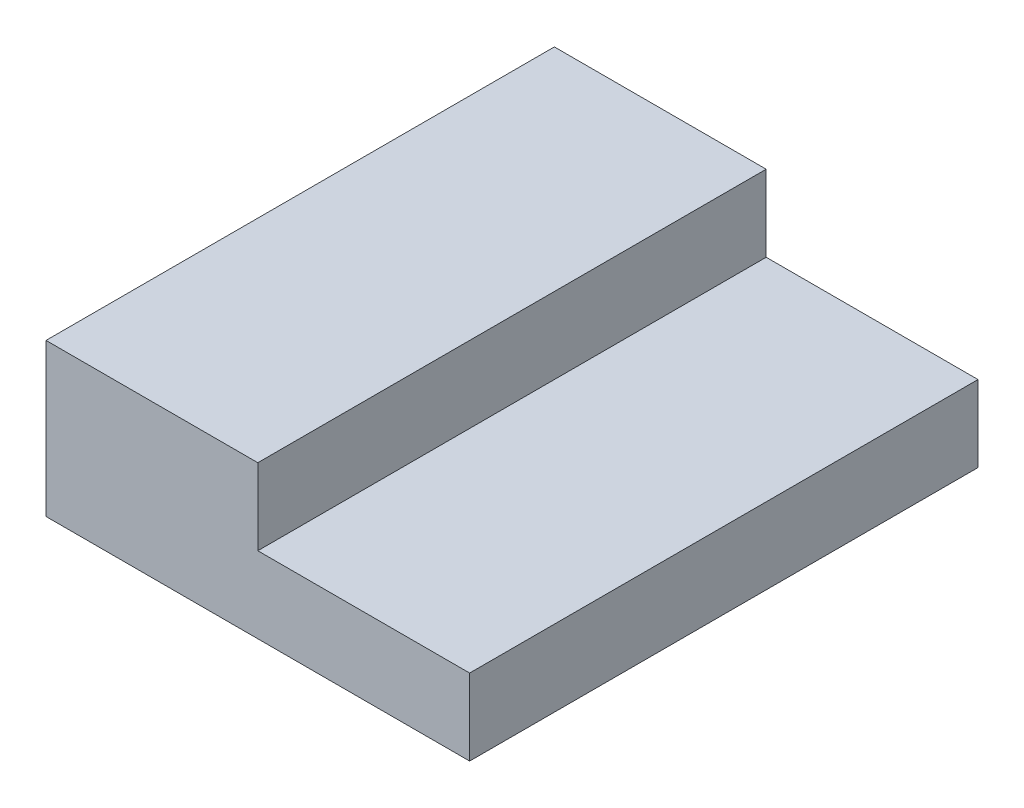
ISO-10303-21;
HEADER;
FILE_DESCRIPTION(('STEP AP214'),'2;1');
FILE_NAME('part.step','',(''),(''),'','','');
FILE_SCHEMA(('AUTOMOTIVE_DESIGN { 1 0 10303 214 1 1 1 1 }'));
ENDSEC;
DATA;
#1=APPLICATION_CONTEXT('core data for automotive mechanical design processes');
#2=APPLICATION_PROTOCOL_DEFINITION('international standard','automotive_design',2000,#1);
#3=PRODUCT_CONTEXT('',#1,'mechanical');
#4=PRODUCT('Part','Part','',(#3));
#5=PRODUCT_RELATED_PRODUCT_CATEGORY('part','',(#4));
#6=PRODUCT_DEFINITION_FORMATION('','',#4);
#7=PRODUCT_DEFINITION_CONTEXT('part definition',#1,'design');
#8=PRODUCT_DEFINITION('design','',#6,#7);
#9=PRODUCT_DEFINITION_SHAPE('','',#8);
#10=(LENGTH_UNIT() NAMED_UNIT(*) SI_UNIT(.MILLI.,.METRE.));
#11=(NAMED_UNIT(*) PLANE_ANGLE_UNIT() SI_UNIT($,.RADIAN.));
#12=(NAMED_UNIT(*) SI_UNIT($,.STERADIAN.) SOLID_ANGLE_UNIT());
#13=UNCERTAINTY_MEASURE_WITH_UNIT(LENGTH_MEASURE(1.E-05),#10,'distance_accuracy_value','');
#14=(GEOMETRIC_REPRESENTATION_CONTEXT(3) GLOBAL_UNCERTAINTY_ASSIGNED_CONTEXT((#13)) GLOBAL_UNIT_ASSIGNED_CONTEXT((#10,
#11,#12)) REPRESENTATION_CONTEXT('',''));
#15=CARTESIAN_POINT('',(0.,0.,0.));
#16=DIRECTION('',(0.,0.,1.));
#17=DIRECTION('',(1.,0.,0.));
#18=AXIS2_PLACEMENT_3D('',#15,#16,#17);
#19=CARTESIAN_POINT('',(0.,18.,60.));
#20=DIRECTION('',(1.,0.,0.));
#21=DIRECTION('',(0.,1.,0.));
#22=AXIS2_PLACEMENT_3D('',#19,#20,#21);
#23=PLANE('',#22);
#24=DIRECTION('',(0.,-1.,0.));
#25=VECTOR('',#24,1.);
#26=CARTESIAN_POINT('',(0.,18.,0.));
#27=LINE('',#26,#25);
#28=CARTESIAN_POINT('',(0.,18.,0.));
#29=VERTEX_POINT('',#28);
#30=CARTESIAN_POINT('',(0.,0.,0.));
#31=VERTEX_POINT('',#30);
#32=EDGE_CURVE('E119',#29,#31,#27,.T.);
#33=ORIENTED_EDGE('',*,*,#32,.T.);
#34=DIRECTION('',(0.,0.,-1.));
#35=VECTOR('',#34,1.);
#36=CARTESIAN_POINT('',(0.,0.,60.));
#37=LINE('',#36,#35);
#38=CARTESIAN_POINT('',(0.,0.,60.));
#39=VERTEX_POINT('',#38);
#40=EDGE_CURVE('E11',#39,#31,#37,.T.);
#41=ORIENTED_EDGE('',*,*,#40,.F.);
#42=DIRECTION('',(0.,-1.,0.));
#43=VECTOR('',#42,1.);
#44=CARTESIAN_POINT('',(0.,18.,60.));
#45=LINE('',#44,#43);
#46=CARTESIAN_POINT('',(0.,18.,60.));
#47=VERTEX_POINT('',#46);
#48=EDGE_CURVE('E129',#47,#39,#45,.T.);
#49=ORIENTED_EDGE('',*,*,#48,.F.);
#50=DIRECTION('',(0.,0.,-1.));
#51=VECTOR('',#50,1.);
#52=CARTESIAN_POINT('',(0.,18.,60.));
#53=LINE('',#52,#51);
#54=EDGE_CURVE('E115',#47,#29,#53,.T.);
#55=ORIENTED_EDGE('',*,*,#54,.T.);
#56=EDGE_LOOP('',(#33,#41,#49,#55));
#57=FACE_BOUND('',#56,.T.);
#58=ADVANCED_FACE('F35',(#57),#23,.F.);
#59=CARTESIAN_POINT('',(0.,0.,60.));
#60=DIRECTION('',(0.,1.,0.));
#61=DIRECTION('',(0.,0.,1.));
#62=AXIS2_PLACEMENT_3D('',#59,#60,#61);
#63=PLANE('',#62);
#64=DIRECTION('',(1.,0.,0.));
#65=VECTOR('',#64,1.);
#66=CARTESIAN_POINT('',(0.,0.,0.));
#67=LINE('',#66,#65);
#68=CARTESIAN_POINT('',(50.,0.,0.));
#69=VERTEX_POINT('',#68);
#70=EDGE_CURVE('E122',#31,#69,#67,.T.);
#71=ORIENTED_EDGE('',*,*,#70,.T.);
#72=DIRECTION('',(0.,0.,-1.));
#73=VECTOR('',#72,1.);
#74=CARTESIAN_POINT('',(50.,0.,60.));
#75=LINE('',#74,#73);
#76=CARTESIAN_POINT('',(50.,0.,60.));
#77=VERTEX_POINT('',#76);
#78=EDGE_CURVE('E43',#77,#69,#75,.T.);
#79=ORIENTED_EDGE('',*,*,#78,.F.);
#80=DIRECTION('',(1.,0.,0.));
#81=VECTOR('',#80,1.);
#82=CARTESIAN_POINT('',(0.,0.,60.));
#83=LINE('',#82,#81);
#84=EDGE_CURVE('E88',#39,#77,#83,.T.);
#85=ORIENTED_EDGE('',*,*,#84,.F.);
#86=ORIENTED_EDGE('',*,*,#40,.T.);
#87=EDGE_LOOP('',(#71,#79,#85,#86));
#88=FACE_BOUND('',#87,.T.);
#89=ADVANCED_FACE('F153',(#88),#63,.F.);
#90=CARTESIAN_POINT('',(50.,0.,60.));
#91=DIRECTION('',(-1.,0.,0.));
#92=DIRECTION('',(0.,0.,1.));
#93=AXIS2_PLACEMENT_3D('',#90,#91,#92);
#94=PLANE('',#93);
#95=DIRECTION('',(0.,1.,0.));
#96=VECTOR('',#95,1.);
#97=CARTESIAN_POINT('',(50.,0.,0.));
#98=LINE('',#97,#96);
#99=CARTESIAN_POINT('',(50.,9.,0.));
#100=VERTEX_POINT('',#99);
#101=EDGE_CURVE('E124',#69,#100,#98,.T.);
#102=ORIENTED_EDGE('',*,*,#101,.T.);
#103=DIRECTION('',(0.,0.,-1.));
#104=VECTOR('',#103,1.);
#105=CARTESIAN_POINT('',(50.,9.,60.));
#106=LINE('',#105,#104);
#107=CARTESIAN_POINT('',(50.,9.,60.));
#108=VERTEX_POINT('',#107);
#109=EDGE_CURVE('E110',#108,#100,#106,.T.);
#110=ORIENTED_EDGE('',*,*,#109,.F.);
#111=DIRECTION('',(0.,1.,0.));
#112=VECTOR('',#111,1.);
#113=CARTESIAN_POINT('',(50.,0.,60.));
#114=LINE('',#113,#112);
#115=EDGE_CURVE('E101',#77,#108,#114,.T.);
#116=ORIENTED_EDGE('',*,*,#115,.F.);
#117=ORIENTED_EDGE('',*,*,#78,.T.);
#118=EDGE_LOOP('',(#102,#110,#116,#117));
#119=FACE_BOUND('',#118,.T.);
#120=ADVANCED_FACE('F135',(#119),#94,.F.);
#121=CARTESIAN_POINT('',(50.,9.,60.));
#122=DIRECTION('',(0.,-1.,0.));
#123=DIRECTION('',(1.,0.,0.));
#124=AXIS2_PLACEMENT_3D('',#121,#122,#123);
#125=PLANE('',#124);
#126=DIRECTION('',(-1.,0.,0.));
#127=VECTOR('',#126,1.);
#128=CARTESIAN_POINT('',(50.,9.,0.));
#129=LINE('',#128,#127);
#130=CARTESIAN_POINT('',(25.,9.,0.));
#131=VERTEX_POINT('',#130);
#132=EDGE_CURVE('E109',#100,#131,#129,.T.);
#133=ORIENTED_EDGE('',*,*,#132,.T.);
#134=DIRECTION('',(0.,0.,-1.));
#135=VECTOR('',#134,1.);
#136=CARTESIAN_POINT('',(25.,9.,60.));
#137=LINE('',#136,#135);
#138=CARTESIAN_POINT('',(25.,9.,60.));
#139=VERTEX_POINT('',#138);
#140=EDGE_CURVE('E106',#139,#131,#137,.T.);
#141=ORIENTED_EDGE('',*,*,#140,.F.);
#142=DIRECTION('',(-1.,0.,0.));
#143=VECTOR('',#142,1.);
#144=CARTESIAN_POINT('',(50.,9.,60.));
#145=LINE('',#144,#143);
#146=EDGE_CURVE('E95',#108,#139,#145,.T.);
#147=ORIENTED_EDGE('',*,*,#146,.F.);
#148=ORIENTED_EDGE('',*,*,#109,.T.);
#149=EDGE_LOOP('',(#133,#141,#147,#148));
#150=FACE_BOUND('',#149,.T.);
#151=ADVANCED_FACE('F107',(#150),#125,.F.);
#152=CARTESIAN_POINT('',(25.,9.,60.));
#153=DIRECTION('',(-1.,0.,0.));
#154=DIRECTION('',(0.,-1.,0.));
#155=AXIS2_PLACEMENT_3D('',#152,#153,#154);
#156=PLANE('',#155);
#157=DIRECTION('',(0.,1.,0.));
#158=VECTOR('',#157,1.);
#159=CARTESIAN_POINT('',(25.,9.,0.));
#160=LINE('',#159,#158);
#161=CARTESIAN_POINT('',(25.,18.,0.));
#162=VERTEX_POINT('',#161);
#163=EDGE_CURVE('E74',#131,#162,#160,.T.);
#164=ORIENTED_EDGE('',*,*,#163,.T.);
#165=DIRECTION('',(0.,0.,-1.));
#166=VECTOR('',#165,1.);
#167=CARTESIAN_POINT('',(25.,18.,60.));
#168=LINE('',#167,#166);
#169=CARTESIAN_POINT('',(25.,18.,60.));
#170=VERTEX_POINT('',#169);
#171=EDGE_CURVE('E111',#170,#162,#168,.T.);
#172=ORIENTED_EDGE('',*,*,#171,.F.);
#173=DIRECTION('',(0.,1.,0.));
#174=VECTOR('',#173,1.);
#175=CARTESIAN_POINT('',(25.,9.,60.));
#176=LINE('',#175,#174);
#177=EDGE_CURVE('E99',#139,#170,#176,.T.);
#178=ORIENTED_EDGE('',*,*,#177,.F.);
#179=ORIENTED_EDGE('',*,*,#140,.T.);
#180=EDGE_LOOP('',(#164,#172,#178,#179));
#181=FACE_BOUND('',#180,.T.);
#182=ADVANCED_FACE('F113',(#181),#156,.F.);
#183=CARTESIAN_POINT('',(25.,18.,60.));
#184=DIRECTION('',(0.,-1.,0.));
#185=DIRECTION('',(1.,0.,0.));
#186=AXIS2_PLACEMENT_3D('',#183,#184,#185);
#187=PLANE('',#186);
#188=DIRECTION('',(-1.,0.,0.));
#189=VECTOR('',#188,1.);
#190=CARTESIAN_POINT('',(25.,18.,0.));
#191=LINE('',#190,#189);
#192=EDGE_CURVE('E80',#162,#29,#191,.T.);
#193=ORIENTED_EDGE('',*,*,#192,.T.);
#194=ORIENTED_EDGE('',*,*,#54,.F.);
#195=DIRECTION('',(-1.,0.,0.));
#196=VECTOR('',#195,1.);
#197=CARTESIAN_POINT('',(25.,18.,60.));
#198=LINE('',#197,#196);
#199=EDGE_CURVE('E51',#170,#47,#198,.T.);
#200=ORIENTED_EDGE('',*,*,#199,.F.);
#201=ORIENTED_EDGE('',*,*,#171,.T.);
#202=EDGE_LOOP('',(#193,#194,#200,#201));
#203=FACE_BOUND('',#202,.T.);
#204=ADVANCED_FACE('F142',(#203),#187,.F.);
#205=CARTESIAN_POINT('',(0.,0.,60.));
#206=DIRECTION('',(0.,0.,1.));
#207=DIRECTION('',(1.,0.,0.));
#208=AXIS2_PLACEMENT_3D('',#205,#206,#207);
#209=PLANE('',#208);
#210=ORIENTED_EDGE('',*,*,#48,.T.);
#211=ORIENTED_EDGE('',*,*,#84,.T.);
#212=ORIENTED_EDGE('',*,*,#115,.T.);
#213=ORIENTED_EDGE('',*,*,#146,.T.);
#214=ORIENTED_EDGE('',*,*,#177,.T.);
#215=ORIENTED_EDGE('',*,*,#199,.T.);
#216=EDGE_LOOP('',(#210,#211,#212,#213,#214,#215));
#217=FACE_BOUND('',#216,.T.);
#218=ADVANCED_FACE('F97',(#217),#209,.T.);
#219=CARTESIAN_POINT('',(0.,0.,0.));
#220=DIRECTION('',(0.,0.,1.));
#221=DIRECTION('',(1.,0.,0.));
#222=AXIS2_PLACEMENT_3D('',#219,#220,#221);
#223=PLANE('',#222);
#224=ORIENTED_EDGE('',*,*,#32,.F.);
#225=ORIENTED_EDGE('',*,*,#192,.F.);
#226=ORIENTED_EDGE('',*,*,#163,.F.);
#227=ORIENTED_EDGE('',*,*,#132,.F.);
#228=ORIENTED_EDGE('',*,*,#101,.F.);
#229=ORIENTED_EDGE('',*,*,#70,.F.);
#230=EDGE_LOOP('',(#224,#225,#226,#227,#228,#229));
#231=FACE_BOUND('',#230,.T.);
#232=ADVANCED_FACE('F138',(#231),#223,.F.);
#233=CLOSED_SHELL('',(#58,#89,#120,#151,#182,#204,#218,#232));
#234=MANIFOLD_SOLID_BREP('B2',#233);
#235=ADVANCED_BREP_SHAPE_REPRESENTATION('',(#18,#234),#14);
#236=SHAPE_DEFINITION_REPRESENTATION(#9,#235);
ENDSEC;
END-ISO-10303-21;
